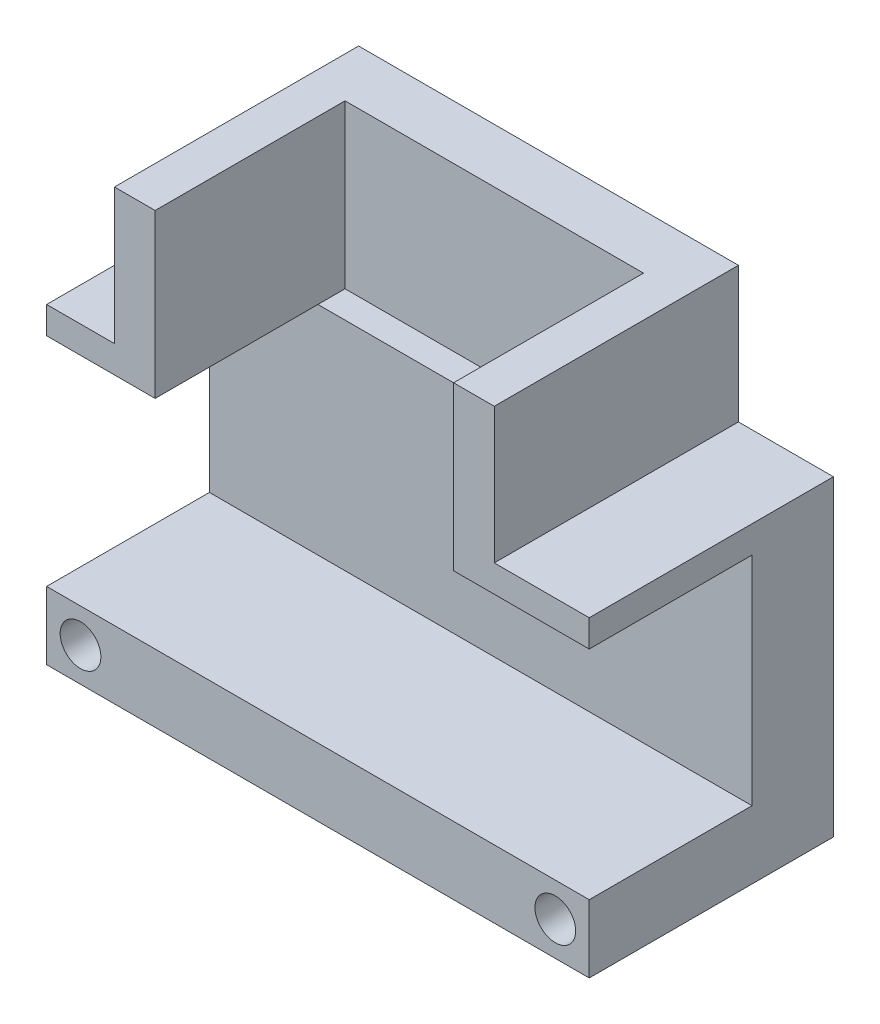
ISO-10303-21;
HEADER;
FILE_DESCRIPTION(('STEP AP214'),'2;1');
FILE_NAME('part.step','',(''),(''),'','','');
FILE_SCHEMA(('AUTOMOTIVE_DESIGN { 1 0 10303 214 1 1 1 1 }'));
ENDSEC;
DATA;
#1=APPLICATION_CONTEXT('core data for automotive mechanical design processes');
#2=APPLICATION_PROTOCOL_DEFINITION('international standard','automotive_design',2000,#1);
#3=PRODUCT_CONTEXT('',#1,'mechanical');
#4=PRODUCT('Part','Part','',(#3));
#5=PRODUCT_RELATED_PRODUCT_CATEGORY('part','',(#4));
#6=PRODUCT_DEFINITION_FORMATION('','',#4);
#7=PRODUCT_DEFINITION_CONTEXT('part definition',#1,'design');
#8=PRODUCT_DEFINITION('design','',#6,#7);
#9=PRODUCT_DEFINITION_SHAPE('','',#8);
#10=(LENGTH_UNIT() NAMED_UNIT(*) SI_UNIT(.MILLI.,.METRE.));
#11=(NAMED_UNIT(*) PLANE_ANGLE_UNIT() SI_UNIT($,.RADIAN.));
#12=(NAMED_UNIT(*) SI_UNIT($,.STERADIAN.) SOLID_ANGLE_UNIT());
#13=UNCERTAINTY_MEASURE_WITH_UNIT(LENGTH_MEASURE(1.E-05),#10,'distance_accuracy_value','');
#14=(GEOMETRIC_REPRESENTATION_CONTEXT(3) GLOBAL_UNCERTAINTY_ASSIGNED_CONTEXT((#13)) GLOBAL_UNIT_ASSIGNED_CONTEXT((#10,
#11,#12)) REPRESENTATION_CONTEXT('',''));
#15=CARTESIAN_POINT('',(0.,0.,0.));
#16=DIRECTION('',(0.,0.,1.));
#17=DIRECTION('',(1.,0.,0.));
#18=AXIS2_PLACEMENT_3D('',#15,#16,#17);
#19=CARTESIAN_POINT('',(0.,0.,4.));
#20=DIRECTION('',(0.,0.,-1.));
#21=DIRECTION('',(-1.,0.,0.));
#22=AXIS2_PLACEMENT_3D('',#19,#20,#21);
#23=PLANE('',#22);
#24=DIRECTION('',(-1.,0.,0.));
#25=VECTOR('',#24,1.);
#26=CARTESIAN_POINT('',(0.,6.42857142857143,4.));
#27=LINE('',#26,#25);
#28=CARTESIAN_POINT('',(-19.2773670403053,6.42857142857143,4.));
#29=VERTEX_POINT('',#28);
#30=CARTESIAN_POINT('',(-41.2773670403053,6.42857142857143,4.));
#31=VERTEX_POINT('',#30);
#32=EDGE_CURVE('E11',#29,#31,#27,.T.);
#33=ORIENTED_EDGE('',*,*,#32,.F.);
#34=DIRECTION('',(0.,1.,0.));
#35=VECTOR('',#34,1.);
#36=CARTESIAN_POINT('',(-19.2773670403053,18.4285714285714,4.));
#37=LINE('',#36,#35);
#38=CARTESIAN_POINT('',(-19.2773670403053,18.4285714285714,4.));
#39=VERTEX_POINT('',#38);
#40=EDGE_CURVE('E298',#29,#39,#37,.T.);
#41=ORIENTED_EDGE('',*,*,#40,.T.);
#42=DIRECTION('',(-1.,0.,0.));
#43=VECTOR('',#42,1.);
#44=CARTESIAN_POINT('',(-41.2773670403053,18.4285714285714,4.));
#45=LINE('',#44,#43);
#46=CARTESIAN_POINT('',(-41.2773670403053,18.4285714285714,4.));
#47=VERTEX_POINT('',#46);
#48=EDGE_CURVE('E154',#39,#47,#45,.T.);
#49=ORIENTED_EDGE('',*,*,#48,.T.);
#50=DIRECTION('',(0.,-1.,0.));
#51=VECTOR('',#50,1.);
#52=CARTESIAN_POINT('',(-41.2773670403053,6.42857142857143,4.));
#53=LINE('',#52,#51);
#54=EDGE_CURVE('E149',#47,#31,#53,.T.);
#55=ORIENTED_EDGE('',*,*,#54,.T.);
#56=EDGE_LOOP('',(#33,#41,#49,#55));
#57=FACE_BOUND('',#56,.T.);
#58=ADVANCED_FACE('F33',(#57),#23,.F.);
#59=CARTESIAN_POINT('',(0.,0.,18.));
#60=DIRECTION('',(0.,0.,1.));
#61=DIRECTION('',(1.,0.,0.));
#62=AXIS2_PLACEMENT_3D('',#59,#60,#61);
#63=PLANE('',#62);
#64=CARTESIAN_POINT('',(-11.7773670403053,-12.0714285714286,18.));
#65=DIRECTION('',(0.,0.,1.));
#66=DIRECTION('',(1.,0.,0.));
#67=AXIS2_PLACEMENT_3D('',#64,#65,#66);
#68=CIRCLE('',#67,1.5);
#69=CARTESIAN_POINT('',(-10.2773670403053,-12.0714285714286,18.));
#70=VERTEX_POINT('',#69);
#71=EDGE_CURVE('E332',#70,#70,#68,.T.);
#72=ORIENTED_EDGE('',*,*,#71,.F.);
#73=EDGE_LOOP('',(#72));
#74=FACE_BOUND('',#73,.T.);
#75=CARTESIAN_POINT('',(-46.7773670403053,-12.0714285714286,18.));
#76=DIRECTION('',(0.,0.,1.));
#77=DIRECTION('',(1.,0.,0.));
#78=AXIS2_PLACEMENT_3D('',#75,#76,#77);
#79=CIRCLE('',#78,1.5);
#80=CARTESIAN_POINT('',(-45.2773670403053,-12.0714285714286,18.));
#81=VERTEX_POINT('',#80);
#82=EDGE_CURVE('E326',#81,#81,#79,.T.);
#83=ORIENTED_EDGE('',*,*,#82,.F.);
#84=EDGE_LOOP('',(#83));
#85=FACE_BOUND('',#84,.T.);
#86=DIRECTION('',(1.,0.,0.));
#87=VECTOR('',#86,1.);
#88=CARTESIAN_POINT('',(-49.2773670403053,-9.57142857142856,18.));
#89=LINE('',#88,#87);
#90=CARTESIAN_POINT('',(-49.2773670403053,-9.57142857142856,18.));
#91=VERTEX_POINT('',#90);
#92=CARTESIAN_POINT('',(-9.27736704030525,-9.57142857142856,18.));
#93=VERTEX_POINT('',#92);
#94=EDGE_CURVE('E297',#91,#93,#89,.T.);
#95=ORIENTED_EDGE('',*,*,#94,.F.);
#96=DIRECTION('',(0.,-1.,0.));
#97=VECTOR('',#96,1.);
#98=CARTESIAN_POINT('',(-49.2773670403053,8.42857142857142,18.));
#99=LINE('',#98,#97);
#100=CARTESIAN_POINT('',(-49.2773670403053,-14.5714285714286,18.));
#101=VERTEX_POINT('',#100);
#102=EDGE_CURVE('E207',#91,#101,#99,.T.);
#103=ORIENTED_EDGE('',*,*,#102,.T.);
#104=DIRECTION('',(1.,0.,0.));
#105=VECTOR('',#104,1.);
#106=CARTESIAN_POINT('',(-49.2773670403053,-14.5714285714286,18.));
#107=LINE('',#106,#105);
#108=CARTESIAN_POINT('',(-9.27736704030525,-14.5714285714286,18.));
#109=VERTEX_POINT('',#108);
#110=EDGE_CURVE('E187',#101,#109,#107,.T.);
#111=ORIENTED_EDGE('',*,*,#110,.T.);
#112=DIRECTION('',(0.,1.,0.));
#113=VECTOR('',#112,1.);
#114=CARTESIAN_POINT('',(-9.27736704030525,-14.5714285714286,18.));
#115=LINE('',#114,#113);
#116=EDGE_CURVE('E192',#109,#93,#115,.T.);
#117=ORIENTED_EDGE('',*,*,#116,.T.);
#118=EDGE_LOOP('',(#95,#103,#111,#117));
#119=FACE_BOUND('',#118,.T.);
#120=ADVANCED_FACE('F347',(#74,#85,#119),#63,.T.);
#121=DIRECTION('',(-1.,0.,0.));
#122=VECTOR('',#121,1.);
#123=CARTESIAN_POINT('',(-49.2773670403053,6.42857142857143,18.));
#124=LINE('',#123,#122);
#125=CARTESIAN_POINT('',(-41.2773670403053,6.42857142857143,18.));
#126=VERTEX_POINT('',#125);
#127=CARTESIAN_POINT('',(-49.2773670403053,6.42857142857143,18.));
#128=VERTEX_POINT('',#127);
#129=EDGE_CURVE('E300',#126,#128,#124,.T.);
#130=ORIENTED_EDGE('',*,*,#129,.F.);
#131=DIRECTION('',(0.,-1.,0.));
#132=VECTOR('',#131,1.);
#133=CARTESIAN_POINT('',(-41.2773670403053,6.42857142857143,18.));
#134=LINE('',#133,#132);
#135=CARTESIAN_POINT('',(-41.2773670403053,18.4285714285714,18.));
#136=VERTEX_POINT('',#135);
#137=EDGE_CURVE('E306',#136,#126,#134,.T.);
#138=ORIENTED_EDGE('',*,*,#137,.F.);
#139=DIRECTION('',(-1.,0.,0.));
#140=VECTOR('',#139,1.);
#141=CARTESIAN_POINT('',(-16.2773670403053,18.4285714285714,18.));
#142=LINE('',#141,#140);
#143=CARTESIAN_POINT('',(-44.2773670403053,18.4285714285714,18.));
#144=VERTEX_POINT('',#143);
#145=EDGE_CURVE('E199',#136,#144,#142,.T.);
#146=ORIENTED_EDGE('',*,*,#145,.T.);
#147=DIRECTION('',(0.,-1.,0.));
#148=VECTOR('',#147,1.);
#149=CARTESIAN_POINT('',(-44.2773670403053,18.4285714285714,18.));
#150=LINE('',#149,#148);
#151=CARTESIAN_POINT('',(-44.2773670403053,8.42857142857142,18.));
#152=VERTEX_POINT('',#151);
#153=EDGE_CURVE('E203',#144,#152,#150,.T.);
#154=ORIENTED_EDGE('',*,*,#153,.T.);
#155=DIRECTION('',(-1.,0.,0.));
#156=VECTOR('',#155,1.);
#157=CARTESIAN_POINT('',(-44.2773670403053,8.42857142857142,18.));
#158=LINE('',#157,#156);
#159=CARTESIAN_POINT('',(-49.2773670403053,8.42857142857142,18.));
#160=VERTEX_POINT('',#159);
#161=EDGE_CURVE('E205',#152,#160,#158,.T.);
#162=ORIENTED_EDGE('',*,*,#161,.T.);
#163=EDGE_CURVE('E208',#160,#128,#99,.T.);
#164=ORIENTED_EDGE('',*,*,#163,.T.);
#165=EDGE_LOOP('',(#130,#138,#146,#154,#162,#164));
#166=FACE_BOUND('',#165,.T.);
#167=ADVANCED_FACE('F317',(#166),#63,.T.);
#168=CARTESIAN_POINT('',(-49.2773670403053,-14.5714285714286,18.));
#169=DIRECTION('',(0.,1.,0.));
#170=DIRECTION('',(0.,0.,1.));
#171=AXIS2_PLACEMENT_3D('',#168,#169,#170);
#172=PLANE('',#171);
#173=DIRECTION('',(1.,0.,0.));
#174=VECTOR('',#173,1.);
#175=CARTESIAN_POINT('',(-49.2773670403053,-14.5714285714286,0.));
#176=LINE('',#175,#174);
#177=CARTESIAN_POINT('',(-49.2773670403053,-14.5714285714286,0.));
#178=VERTEX_POINT('',#177);
#179=CARTESIAN_POINT('',(-9.27736704030525,-14.5714285714286,0.));
#180=VERTEX_POINT('',#179);
#181=EDGE_CURVE('E212',#178,#180,#176,.T.);
#182=ORIENTED_EDGE('',*,*,#181,.T.);
#183=DIRECTION('',(0.,0.,-1.));
#184=VECTOR('',#183,1.);
#185=CARTESIAN_POINT('',(-9.27736704030525,-14.5714285714286,18.));
#186=LINE('',#185,#184);
#187=EDGE_CURVE('E41',#109,#180,#186,.T.);
#188=ORIENTED_EDGE('',*,*,#187,.F.);
#189=ORIENTED_EDGE('',*,*,#110,.F.);
#190=DIRECTION('',(0.,0.,-1.));
#191=VECTOR('',#190,1.);
#192=CARTESIAN_POINT('',(-49.2773670403053,-14.5714285714286,18.));
#193=LINE('',#192,#191);
#194=EDGE_CURVE('E211',#101,#178,#193,.T.);
#195=ORIENTED_EDGE('',*,*,#194,.T.);
#196=EDGE_LOOP('',(#182,#188,#189,#195));
#197=FACE_BOUND('',#196,.T.);
#198=ADVANCED_FACE('F35',(#197),#172,.F.);
#199=CARTESIAN_POINT('',(-9.27736704030525,-14.5714285714286,18.));
#200=DIRECTION('',(-1.,0.,0.));
#201=DIRECTION('',(0.,-1.,0.));
#202=AXIS2_PLACEMENT_3D('',#199,#200,#201);
#203=PLANE('',#202);
#204=DIRECTION('',(0.,1.,0.));
#205=VECTOR('',#204,1.);
#206=CARTESIAN_POINT('',(-9.27736704030526,6.42857142857143,6.));
#207=LINE('',#206,#205);
#208=CARTESIAN_POINT('',(-9.27736704030525,-9.57142857142856,6.));
#209=VERTEX_POINT('',#208);
#210=CARTESIAN_POINT('',(-9.27736704030526,6.42857142857143,6.));
#211=VERTEX_POINT('',#210);
#212=EDGE_CURVE('E283',#209,#211,#207,.T.);
#213=ORIENTED_EDGE('',*,*,#212,.F.);
#214=DIRECTION('',(0.,0.,1.));
#215=VECTOR('',#214,1.);
#216=CARTESIAN_POINT('',(-9.27736704030525,-9.57142857142856,4.));
#217=LINE('',#216,#215);
#218=EDGE_CURVE('E53',#209,#93,#217,.T.);
#219=ORIENTED_EDGE('',*,*,#218,.T.);
#220=ORIENTED_EDGE('',*,*,#116,.F.);
#221=ORIENTED_EDGE('',*,*,#187,.T.);
#222=DIRECTION('',(0.,1.,0.));
#223=VECTOR('',#222,1.);
#224=CARTESIAN_POINT('',(-9.27736704030525,-14.5714285714286,0.));
#225=LINE('',#224,#223);
#226=CARTESIAN_POINT('',(-9.27736704030529,8.42857142857143,0.));
#227=VERTEX_POINT('',#226);
#228=EDGE_CURVE('E215',#180,#227,#225,.T.);
#229=ORIENTED_EDGE('',*,*,#228,.T.);
#230=DIRECTION('',(0.,0.,-1.));
#231=VECTOR('',#230,1.);
#232=CARTESIAN_POINT('',(-9.27736704030529,8.42857142857143,18.));
#233=LINE('',#232,#231);
#234=CARTESIAN_POINT('',(-9.27736704030529,8.42857142857143,18.));
#235=VERTEX_POINT('',#234);
#236=EDGE_CURVE('E246',#235,#227,#233,.T.);
#237=ORIENTED_EDGE('',*,*,#236,.F.);
#238=CARTESIAN_POINT('',(-9.27736704030528,6.42857142857143,18.));
#239=VERTEX_POINT('',#238);
#240=EDGE_CURVE('E190',#239,#235,#115,.T.);
#241=ORIENTED_EDGE('',*,*,#240,.F.);
#242=DIRECTION('',(0.,0.,1.));
#243=VECTOR('',#242,1.);
#244=CARTESIAN_POINT('',(-9.27736704030526,6.42857142857143,4.));
#245=LINE('',#244,#243);
#246=EDGE_CURVE('E182',#211,#239,#245,.T.);
#247=ORIENTED_EDGE('',*,*,#246,.F.);
#248=EDGE_LOOP('',(#213,#219,#220,#221,#229,#237,#241,#247));
#249=FACE_BOUND('',#248,.T.);
#250=ADVANCED_FACE('F252',(#249),#203,.F.);
#251=CARTESIAN_POINT('',(-9.27736704030529,8.42857142857143,18.));
#252=DIRECTION('',(0.,-1.,0.));
#253=DIRECTION('',(0.,0.,-1.));
#254=AXIS2_PLACEMENT_3D('',#251,#252,#253);
#255=PLANE('',#254);
#256=DIRECTION('',(-1.,0.,0.));
#257=VECTOR('',#256,1.);
#258=CARTESIAN_POINT('',(-9.27736704030529,8.42857142857143,0.));
#259=LINE('',#258,#257);
#260=CARTESIAN_POINT('',(-16.2773670403053,8.42857142857143,0.));
#261=VERTEX_POINT('',#260);
#262=EDGE_CURVE('E218',#227,#261,#259,.T.);
#263=ORIENTED_EDGE('',*,*,#262,.T.);
#264=DIRECTION('',(0.,0.,-1.));
#265=VECTOR('',#264,1.);
#266=CARTESIAN_POINT('',(-16.2773670403053,8.42857142857143,18.));
#267=LINE('',#266,#265);
#268=CARTESIAN_POINT('',(-16.2773670403053,8.42857142857143,18.));
#269=VERTEX_POINT('',#268);
#270=EDGE_CURVE('E243',#269,#261,#267,.T.);
#271=ORIENTED_EDGE('',*,*,#270,.F.);
#272=DIRECTION('',(-1.,0.,0.));
#273=VECTOR('',#272,1.);
#274=CARTESIAN_POINT('',(-9.27736704030529,8.42857142857143,18.));
#275=LINE('',#274,#273);
#276=EDGE_CURVE('E195',#235,#269,#275,.T.);
#277=ORIENTED_EDGE('',*,*,#276,.F.);
#278=ORIENTED_EDGE('',*,*,#236,.T.);
#279=EDGE_LOOP('',(#263,#271,#277,#278));
#280=FACE_BOUND('',#279,.T.);
#281=ADVANCED_FACE('F267',(#280),#255,.F.);
#282=CARTESIAN_POINT('',(-16.2773670403053,8.42857142857143,18.));
#283=DIRECTION('',(-1.,0.,0.));
#284=DIRECTION('',(0.,0.,1.));
#285=AXIS2_PLACEMENT_3D('',#282,#283,#284);
#286=PLANE('',#285);
#287=DIRECTION('',(0.,1.,0.));
#288=VECTOR('',#287,1.);
#289=CARTESIAN_POINT('',(-16.2773670403053,8.42857142857143,0.));
#290=LINE('',#289,#288);
#291=CARTESIAN_POINT('',(-16.2773670403053,18.4285714285714,0.));
#292=VERTEX_POINT('',#291);
#293=EDGE_CURVE('E220',#261,#292,#290,.T.);
#294=ORIENTED_EDGE('',*,*,#293,.T.);
#295=DIRECTION('',(0.,0.,-1.));
#296=VECTOR('',#295,1.);
#297=CARTESIAN_POINT('',(-16.2773670403053,18.4285714285714,18.));
#298=LINE('',#297,#296);
#299=CARTESIAN_POINT('',(-16.2773670403053,18.4285714285714,18.));
#300=VERTEX_POINT('',#299);
#301=EDGE_CURVE('E240',#300,#292,#298,.T.);
#302=ORIENTED_EDGE('',*,*,#301,.F.);
#303=DIRECTION('',(0.,1.,0.));
#304=VECTOR('',#303,1.);
#305=CARTESIAN_POINT('',(-16.2773670403053,8.42857142857143,18.));
#306=LINE('',#305,#304);
#307=EDGE_CURVE('E197',#269,#300,#306,.T.);
#308=ORIENTED_EDGE('',*,*,#307,.F.);
#309=ORIENTED_EDGE('',*,*,#270,.T.);
#310=EDGE_LOOP('',(#294,#302,#308,#309));
#311=FACE_BOUND('',#310,.T.);
#312=ADVANCED_FACE('F271',(#311),#286,.F.);
#313=CARTESIAN_POINT('',(-16.2773670403053,18.4285714285714,18.));
#314=DIRECTION('',(0.,-1.,0.));
#315=DIRECTION('',(1.,0.,0.));
#316=AXIS2_PLACEMENT_3D('',#313,#314,#315);
#317=PLANE('',#316);
#318=ORIENTED_EDGE('',*,*,#145,.F.);
#319=DIRECTION('',(0.,0.,1.));
#320=VECTOR('',#319,1.);
#321=CARTESIAN_POINT('',(-41.2773670403053,18.4285714285714,4.));
#322=LINE('',#321,#320);
#323=EDGE_CURVE('E180',#47,#136,#322,.T.);
#324=ORIENTED_EDGE('',*,*,#323,.F.);
#325=ORIENTED_EDGE('',*,*,#48,.F.);
#326=DIRECTION('',(0.,0.,1.));
#327=VECTOR('',#326,1.);
#328=CARTESIAN_POINT('',(-19.2773670403053,18.4285714285714,4.));
#329=LINE('',#328,#327);
#330=CARTESIAN_POINT('',(-19.2773670403053,18.4285714285714,18.));
#331=VERTEX_POINT('',#330);
#332=EDGE_CURVE('E176',#39,#331,#329,.T.);
#333=ORIENTED_EDGE('',*,*,#332,.T.);
#334=EDGE_CURVE('E200',#300,#331,#142,.T.);
#335=ORIENTED_EDGE('',*,*,#334,.F.);
#336=ORIENTED_EDGE('',*,*,#301,.T.);
#337=DIRECTION('',(-1.,0.,0.));
#338=VECTOR('',#337,1.);
#339=CARTESIAN_POINT('',(-16.2773670403053,18.4285714285714,0.));
#340=LINE('',#339,#338);
#341=CARTESIAN_POINT('',(-44.2773670403053,18.4285714285714,0.));
#342=VERTEX_POINT('',#341);
#343=EDGE_CURVE('E222',#292,#342,#340,.T.);
#344=ORIENTED_EDGE('',*,*,#343,.T.);
#345=DIRECTION('',(0.,0.,-1.));
#346=VECTOR('',#345,1.);
#347=CARTESIAN_POINT('',(-44.2773670403053,18.4285714285714,18.));
#348=LINE('',#347,#346);
#349=EDGE_CURVE('E237',#144,#342,#348,.T.);
#350=ORIENTED_EDGE('',*,*,#349,.F.);
#351=EDGE_LOOP('',(#318,#324,#325,#333,#335,#336,#344,#350));
#352=FACE_BOUND('',#351,.T.);
#353=ADVANCED_FACE('F382',(#352),#317,.F.);
#354=CARTESIAN_POINT('',(-44.2773670403053,18.4285714285714,18.));
#355=DIRECTION('',(1.,0.,0.));
#356=DIRECTION('',(0.,0.,-1.));
#357=AXIS2_PLACEMENT_3D('',#354,#355,#356);
#358=PLANE('',#357);
#359=DIRECTION('',(0.,-1.,0.));
#360=VECTOR('',#359,1.);
#361=CARTESIAN_POINT('',(-44.2773670403053,18.4285714285714,0.));
#362=LINE('',#361,#360);
#363=CARTESIAN_POINT('',(-44.2773670403053,8.42857142857142,0.));
#364=VERTEX_POINT('',#363);
#365=EDGE_CURVE('E224',#342,#364,#362,.T.);
#366=ORIENTED_EDGE('',*,*,#365,.T.);
#367=DIRECTION('',(0.,0.,-1.));
#368=VECTOR('',#367,1.);
#369=CARTESIAN_POINT('',(-44.2773670403053,8.42857142857142,18.));
#370=LINE('',#369,#368);
#371=EDGE_CURVE('E234',#152,#364,#370,.T.);
#372=ORIENTED_EDGE('',*,*,#371,.F.);
#373=ORIENTED_EDGE('',*,*,#153,.F.);
#374=ORIENTED_EDGE('',*,*,#349,.T.);
#375=EDGE_LOOP('',(#366,#372,#373,#374));
#376=FACE_BOUND('',#375,.T.);
#377=ADVANCED_FACE('F387',(#376),#358,.F.);
#378=CARTESIAN_POINT('',(-44.2773670403053,8.42857142857142,18.));
#379=DIRECTION('',(0.,-1.,0.));
#380=DIRECTION('',(1.,0.,0.));
#381=AXIS2_PLACEMENT_3D('',#378,#379,#380);
#382=PLANE('',#381);
#383=DIRECTION('',(-1.,0.,0.));
#384=VECTOR('',#383,1.);
#385=CARTESIAN_POINT('',(-44.2773670403053,8.42857142857142,0.));
#386=LINE('',#385,#384);
#387=CARTESIAN_POINT('',(-49.2773670403053,8.42857142857142,0.));
#388=VERTEX_POINT('',#387);
#389=EDGE_CURVE('E226',#364,#388,#386,.T.);
#390=ORIENTED_EDGE('',*,*,#389,.T.);
#391=DIRECTION('',(0.,0.,-1.));
#392=VECTOR('',#391,1.);
#393=CARTESIAN_POINT('',(-49.2773670403053,8.42857142857142,18.));
#394=LINE('',#393,#392);
#395=EDGE_CURVE('E231',#160,#388,#394,.T.);
#396=ORIENTED_EDGE('',*,*,#395,.F.);
#397=ORIENTED_EDGE('',*,*,#161,.F.);
#398=ORIENTED_EDGE('',*,*,#371,.T.);
#399=EDGE_LOOP('',(#390,#396,#397,#398));
#400=FACE_BOUND('',#399,.T.);
#401=ADVANCED_FACE('F390',(#400),#382,.F.);
#402=CARTESIAN_POINT('',(-49.2773670403053,8.42857142857142,18.));
#403=DIRECTION('',(1.,0.,0.));
#404=DIRECTION('',(0.,1.,0.));
#405=AXIS2_PLACEMENT_3D('',#402,#403,#404);
#406=PLANE('',#405);
#407=DIRECTION('',(0.,0.,1.));
#408=VECTOR('',#407,1.);
#409=CARTESIAN_POINT('',(-49.2773670403053,-9.57142857142856,4.));
#410=LINE('',#409,#408);
#411=CARTESIAN_POINT('',(-49.2773670403053,-9.57142857142856,6.));
#412=VERTEX_POINT('',#411);
#413=EDGE_CURVE('E216',#412,#91,#410,.T.);
#414=ORIENTED_EDGE('',*,*,#413,.F.);
#415=DIRECTION('',(0.,-1.,0.));
#416=VECTOR('',#415,1.);
#417=CARTESIAN_POINT('',(-49.2773670403053,6.42857142857143,6.));
#418=LINE('',#417,#416);
#419=CARTESIAN_POINT('',(-49.2773670403053,6.42857142857143,6.));
#420=VERTEX_POINT('',#419);
#421=EDGE_CURVE('E293',#420,#412,#418,.T.);
#422=ORIENTED_EDGE('',*,*,#421,.F.);
#423=DIRECTION('',(0.,0.,1.));
#424=VECTOR('',#423,1.);
#425=CARTESIAN_POINT('',(-49.2773670403053,6.42857142857143,4.));
#426=LINE('',#425,#424);
#427=EDGE_CURVE('E167',#420,#128,#426,.T.);
#428=ORIENTED_EDGE('',*,*,#427,.T.);
#429=ORIENTED_EDGE('',*,*,#163,.F.);
#430=ORIENTED_EDGE('',*,*,#395,.T.);
#431=DIRECTION('',(0.,-1.,0.));
#432=VECTOR('',#431,1.);
#433=CARTESIAN_POINT('',(-49.2773670403053,8.42857142857142,0.));
#434=LINE('',#433,#432);
#435=EDGE_CURVE('E191',#388,#178,#434,.T.);
#436=ORIENTED_EDGE('',*,*,#435,.T.);
#437=ORIENTED_EDGE('',*,*,#194,.F.);
#438=ORIENTED_EDGE('',*,*,#102,.F.);
#439=EDGE_LOOP('',(#414,#422,#428,#429,#430,#436,#437,#438));
#440=FACE_BOUND('',#439,.T.);
#441=ADVANCED_FACE('F322',(#440),#406,.F.);
#442=DIRECTION('',(0.,1.,0.));
#443=VECTOR('',#442,1.);
#444=CARTESIAN_POINT('',(-19.2773670403053,18.4285714285714,18.));
#445=LINE('',#444,#443);
#446=CARTESIAN_POINT('',(-19.2773670403053,6.42857142857143,18.));
#447=VERTEX_POINT('',#446);
#448=EDGE_CURVE('E304',#447,#331,#445,.T.);
#449=ORIENTED_EDGE('',*,*,#448,.F.);
#450=DIRECTION('',(-1.,0.,0.));
#451=VECTOR('',#450,1.);
#452=CARTESIAN_POINT('',(-9.27736704030526,6.42857142857143,18.));
#453=LINE('',#452,#451);
#454=EDGE_CURVE('E280',#239,#447,#453,.T.);
#455=ORIENTED_EDGE('',*,*,#454,.F.);
#456=ORIENTED_EDGE('',*,*,#240,.T.);
#457=ORIENTED_EDGE('',*,*,#276,.T.);
#458=ORIENTED_EDGE('',*,*,#307,.T.);
#459=ORIENTED_EDGE('',*,*,#334,.T.);
#460=EDGE_LOOP('',(#449,#455,#456,#457,#458,#459));
#461=FACE_BOUND('',#460,.T.);
#462=ADVANCED_FACE('F276',(#461),#63,.T.);
#463=CARTESIAN_POINT('',(0.,0.,0.));
#464=DIRECTION('',(0.,0.,1.));
#465=DIRECTION('',(1.,0.,0.));
#466=AXIS2_PLACEMENT_3D('',#463,#464,#465);
#467=PLANE('',#466);
#468=ORIENTED_EDGE('',*,*,#181,.F.);
#469=ORIENTED_EDGE('',*,*,#435,.F.);
#470=ORIENTED_EDGE('',*,*,#389,.F.);
#471=ORIENTED_EDGE('',*,*,#365,.F.);
#472=ORIENTED_EDGE('',*,*,#343,.F.);
#473=ORIENTED_EDGE('',*,*,#293,.F.);
#474=ORIENTED_EDGE('',*,*,#262,.F.);
#475=ORIENTED_EDGE('',*,*,#228,.F.);
#476=EDGE_LOOP('',(#468,#469,#470,#471,#472,#473,#474,#475));
#477=FACE_BOUND('',#476,.T.);
#478=ADVANCED_FACE('F260',(#477),#467,.F.);
#479=CARTESIAN_POINT('',(-49.2773670403053,-9.57142857142856,4.));
#480=DIRECTION('',(0.,-1.,0.));
#481=DIRECTION('',(0.,0.,-1.));
#482=AXIS2_PLACEMENT_3D('',#479,#480,#481);
#483=PLANE('',#482);
#484=ORIENTED_EDGE('',*,*,#218,.F.);
#485=DIRECTION('',(1.,0.,0.));
#486=VECTOR('',#485,1.);
#487=CARTESIAN_POINT('',(-49.2773670403053,-9.57142857142856,6.));
#488=LINE('',#487,#486);
#489=EDGE_CURVE('E48',#412,#209,#488,.T.);
#490=ORIENTED_EDGE('',*,*,#489,.F.);
#491=ORIENTED_EDGE('',*,*,#413,.T.);
#492=ORIENTED_EDGE('',*,*,#94,.T.);
#493=EDGE_LOOP('',(#484,#490,#491,#492));
#494=FACE_BOUND('',#493,.T.);
#495=ADVANCED_FACE('F355',(#494),#483,.F.);
#496=CARTESIAN_POINT('',(-49.2773670403053,6.42857142857143,4.));
#497=DIRECTION('',(0.,1.,0.));
#498=DIRECTION('',(-1.,0.,0.));
#499=AXIS2_PLACEMENT_3D('',#496,#497,#498);
#500=PLANE('',#499);
#501=ORIENTED_EDGE('',*,*,#427,.F.);
#502=DIRECTION('',(-1.,0.,0.));
#503=VECTOR('',#502,1.);
#504=CARTESIAN_POINT('',(-49.2773670403053,6.42857142857143,6.));
#505=LINE('',#504,#503);
#506=CARTESIAN_POINT('',(-41.2773670403053,6.42857142857143,6.));
#507=VERTEX_POINT('',#506);
#508=EDGE_CURVE('E289',#507,#420,#505,.T.);
#509=ORIENTED_EDGE('',*,*,#508,.F.);
#510=DIRECTION('',(0.,0.,1.));
#511=VECTOR('',#510,1.);
#512=CARTESIAN_POINT('',(-41.2773670403053,6.42857142857143,4.));
#513=LINE('',#512,#511);
#514=EDGE_CURVE('E163',#507,#126,#513,.T.);
#515=ORIENTED_EDGE('',*,*,#514,.T.);
#516=ORIENTED_EDGE('',*,*,#129,.T.);
#517=EDGE_LOOP('',(#501,#509,#515,#516));
#518=FACE_BOUND('',#517,.T.);
#519=ADVANCED_FACE('F313',(#518),#500,.F.);
#520=CARTESIAN_POINT('',(-41.2773670403053,6.42857142857143,4.));
#521=DIRECTION('',(-1.,0.,0.));
#522=DIRECTION('',(0.,0.,1.));
#523=AXIS2_PLACEMENT_3D('',#520,#521,#522);
#524=PLANE('',#523);
#525=ORIENTED_EDGE('',*,*,#137,.T.);
#526=ORIENTED_EDGE('',*,*,#514,.F.);
#527=EDGE_CURVE('E160',#31,#507,#513,.T.);
#528=ORIENTED_EDGE('',*,*,#527,.F.);
#529=ORIENTED_EDGE('',*,*,#54,.F.);
#530=ORIENTED_EDGE('',*,*,#323,.T.);
#531=EDGE_LOOP('',(#525,#526,#528,#529,#530));
#532=FACE_BOUND('',#531,.T.);
#533=ADVANCED_FACE('F162',(#532),#524,.F.);
#534=CARTESIAN_POINT('',(-19.2773670403053,18.4285714285714,4.));
#535=DIRECTION('',(1.,0.,0.));
#536=DIRECTION('',(0.,0.,-1.));
#537=AXIS2_PLACEMENT_3D('',#534,#535,#536);
#538=PLANE('',#537);
#539=ORIENTED_EDGE('',*,*,#448,.T.);
#540=ORIENTED_EDGE('',*,*,#332,.F.);
#541=ORIENTED_EDGE('',*,*,#40,.F.);
#542=DIRECTION('',(0.,0.,1.));
#543=VECTOR('',#542,1.);
#544=CARTESIAN_POINT('',(-19.2773670403053,6.42857142857143,4.));
#545=LINE('',#544,#543);
#546=CARTESIAN_POINT('',(-19.2773670403053,6.42857142857143,6.));
#547=VERTEX_POINT('',#546);
#548=EDGE_CURVE('E172',#29,#547,#545,.T.);
#549=ORIENTED_EDGE('',*,*,#548,.T.);
#550=EDGE_CURVE('E177',#547,#447,#545,.T.);
#551=ORIENTED_EDGE('',*,*,#550,.T.);
#552=EDGE_LOOP('',(#539,#540,#541,#549,#551));
#553=FACE_BOUND('',#552,.T.);
#554=ADVANCED_FACE('F374',(#553),#538,.F.);
#555=CARTESIAN_POINT('',(-9.27736704030526,6.42857142857143,4.));
#556=DIRECTION('',(0.,1.,0.));
#557=DIRECTION('',(0.,0.,1.));
#558=AXIS2_PLACEMENT_3D('',#555,#556,#557);
#559=PLANE('',#558);
#560=ORIENTED_EDGE('',*,*,#550,.F.);
#561=EDGE_CURVE('E288',#211,#547,#505,.T.);
#562=ORIENTED_EDGE('',*,*,#561,.F.);
#563=ORIENTED_EDGE('',*,*,#246,.T.);
#564=ORIENTED_EDGE('',*,*,#454,.T.);
#565=EDGE_LOOP('',(#560,#562,#563,#564));
#566=FACE_BOUND('',#565,.T.);
#567=ADVANCED_FACE('F376',(#566),#559,.F.);
#568=CARTESIAN_POINT('',(-49.2773670403053,6.42857142857143,6.));
#569=DIRECTION('',(0.,-1.,0.));
#570=DIRECTION('',(0.,0.,-1.));
#571=AXIS2_PLACEMENT_3D('',#568,#569,#570);
#572=PLANE('',#571);
#573=ORIENTED_EDGE('',*,*,#32,.T.);
#574=ORIENTED_EDGE('',*,*,#527,.T.);
#575=EDGE_CURVE('E173',#547,#507,#505,.T.);
#576=ORIENTED_EDGE('',*,*,#575,.F.);
#577=ORIENTED_EDGE('',*,*,#548,.F.);
#578=EDGE_LOOP('',(#573,#574,#576,#577));
#579=FACE_BOUND('',#578,.T.);
#580=ADVANCED_FACE('F170',(#579),#572,.F.);
#581=CARTESIAN_POINT('',(0.,0.,6.));
#582=DIRECTION('',(0.,0.,1.));
#583=DIRECTION('',(1.,0.,0.));
#584=AXIS2_PLACEMENT_3D('',#581,#582,#583);
#585=PLANE('',#584);
#586=ORIENTED_EDGE('',*,*,#421,.T.);
#587=ORIENTED_EDGE('',*,*,#489,.T.);
#588=ORIENTED_EDGE('',*,*,#212,.T.);
#589=ORIENTED_EDGE('',*,*,#561,.T.);
#590=ORIENTED_EDGE('',*,*,#575,.T.);
#591=ORIENTED_EDGE('',*,*,#508,.T.);
#592=EDGE_LOOP('',(#586,#587,#588,#589,#590,#591));
#593=FACE_BOUND('',#592,.T.);
#594=ADVANCED_FACE('F287',(#593),#585,.T.);
#595=CARTESIAN_POINT('',(-46.7773670403053,-12.0714285714286,8.));
#596=DIRECTION('',(0.,0.,1.));
#597=DIRECTION('',(1.,0.,0.));
#598=AXIS2_PLACEMENT_3D('',#595,#596,#597);
#599=CYLINDRICAL_SURFACE('',#598,1.5);
#600=CARTESIAN_POINT('',(-46.7773670403053,-12.0714285714286,8.));
#601=DIRECTION('',(0.,0.,1.));
#602=DIRECTION('',(1.,0.,0.));
#603=AXIS2_PLACEMENT_3D('',#600,#601,#602);
#604=CIRCLE('',#603,1.5);
#605=CARTESIAN_POINT('',(-45.2773670403053,-12.0714285714286,8.));
#606=VERTEX_POINT('',#605);
#607=EDGE_CURVE('E324',#606,#606,#604,.T.);
#608=ORIENTED_EDGE('',*,*,#607,.F.);
#609=EDGE_LOOP('',(#608));
#610=FACE_BOUND('',#609,.T.);
#611=ORIENTED_EDGE('',*,*,#82,.T.);
#612=EDGE_LOOP('',(#611));
#613=FACE_BOUND('',#612,.T.);
#614=ADVANCED_FACE('F491',(#610,#613),#599,.F.);
#615=CARTESIAN_POINT('',(-46.7773670403053,-12.0714285714286,8.));
#616=DIRECTION('',(0.,0.,1.));
#617=DIRECTION('',(1.,0.,0.));
#618=AXIS2_PLACEMENT_3D('',#615,#616,#617);
#619=PLANE('',#618);
#620=ORIENTED_EDGE('',*,*,#607,.T.);
#621=EDGE_LOOP('',(#620));
#622=FACE_BOUND('',#621,.T.);
#623=ADVANCED_FACE('F343',(#622),#619,.T.);
#624=CARTESIAN_POINT('',(-11.7773670403053,-12.0714285714286,8.));
#625=DIRECTION('',(0.,0.,1.));
#626=DIRECTION('',(1.,0.,0.));
#627=AXIS2_PLACEMENT_3D('',#624,#625,#626);
#628=CYLINDRICAL_SURFACE('',#627,1.5);
#629=CARTESIAN_POINT('',(-11.7773670403053,-12.0714285714286,8.));
#630=DIRECTION('',(0.,0.,1.));
#631=DIRECTION('',(1.,0.,0.));
#632=AXIS2_PLACEMENT_3D('',#629,#630,#631);
#633=CIRCLE('',#632,1.5);
#634=CARTESIAN_POINT('',(-10.2773670403053,-12.0714285714286,8.));
#635=VERTEX_POINT('',#634);
#636=EDGE_CURVE('E330',#635,#635,#633,.T.);
#637=ORIENTED_EDGE('',*,*,#636,.F.);
#638=EDGE_LOOP('',(#637));
#639=FACE_BOUND('',#638,.T.);
#640=ORIENTED_EDGE('',*,*,#71,.T.);
#641=EDGE_LOOP('',(#640));
#642=FACE_BOUND('',#641,.T.);
#643=ADVANCED_FACE('F340',(#639,#642),#628,.F.);
#644=CARTESIAN_POINT('',(-11.7773670403053,-12.0714285714286,8.));
#645=DIRECTION('',(0.,0.,1.));
#646=DIRECTION('',(1.,0.,0.));
#647=AXIS2_PLACEMENT_3D('',#644,#645,#646);
#648=PLANE('',#647);
#649=ORIENTED_EDGE('',*,*,#636,.T.);
#650=EDGE_LOOP('',(#649));
#651=FACE_BOUND('',#650,.T.);
#652=ADVANCED_FACE('F338',(#651),#648,.T.);
#653=CLOSED_SHELL('',(#58,#120,#167,#198,#250,#281,#312,#353,#377,#401,#441,#462,#478,#495,#519,
#533,#554,#567,#580,#594,#614,#623,#643,#652));
#654=MANIFOLD_SOLID_BREP('B2',#653);
#655=ADVANCED_BREP_SHAPE_REPRESENTATION('',(#18,#654),#14);
#656=SHAPE_DEFINITION_REPRESENTATION(#9,#655);
ENDSEC;
END-ISO-10303-21;
